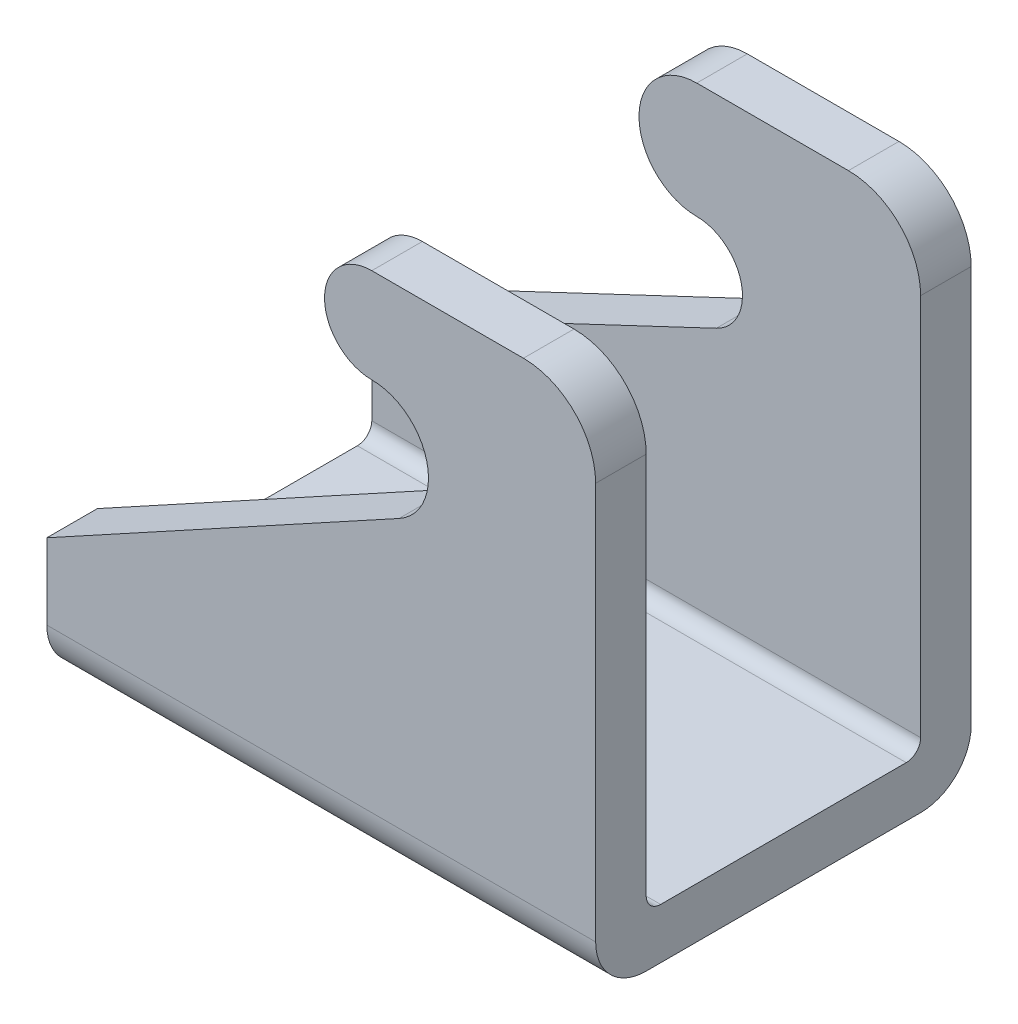
ISO-10303-21;
HEADER;
FILE_DESCRIPTION(('STEP AP214'),'2;1');
FILE_NAME('part.step','',(''),(''),'','','');
FILE_SCHEMA(('AUTOMOTIVE_DESIGN { 1 0 10303 214 1 1 1 1 }'));
ENDSEC;
DATA;
#1=APPLICATION_CONTEXT('core data for automotive mechanical design processes');
#2=APPLICATION_PROTOCOL_DEFINITION('international standard','automotive_design',2000,#1);
#3=PRODUCT_CONTEXT('',#1,'mechanical');
#4=PRODUCT('Part','Part','',(#3));
#5=PRODUCT_RELATED_PRODUCT_CATEGORY('part','',(#4));
#6=PRODUCT_DEFINITION_FORMATION('','',#4);
#7=PRODUCT_DEFINITION_CONTEXT('part definition',#1,'design');
#8=PRODUCT_DEFINITION('design','',#6,#7);
#9=PRODUCT_DEFINITION_SHAPE('','',#8);
#10=(LENGTH_UNIT() NAMED_UNIT(*) SI_UNIT(.MILLI.,.METRE.));
#11=(NAMED_UNIT(*) PLANE_ANGLE_UNIT() SI_UNIT($,.RADIAN.));
#12=(NAMED_UNIT(*) SI_UNIT($,.STERADIAN.) SOLID_ANGLE_UNIT());
#13=UNCERTAINTY_MEASURE_WITH_UNIT(LENGTH_MEASURE(1.E-05),#10,'distance_accuracy_value','');
#14=(GEOMETRIC_REPRESENTATION_CONTEXT(3) GLOBAL_UNCERTAINTY_ASSIGNED_CONTEXT((#13)) GLOBAL_UNIT_ASSIGNED_CONTEXT((#10,
#11,#12)) REPRESENTATION_CONTEXT('',''));
#15=CARTESIAN_POINT('',(0.,0.,0.));
#16=DIRECTION('',(0.,0.,1.));
#17=DIRECTION('',(1.,0.,0.));
#18=AXIS2_PLACEMENT_3D('',#15,#16,#17);
#19=CARTESIAN_POINT('',(38.,36.,-13.));
#20=DIRECTION('',(0.,1.,0.));
#21=DIRECTION('',(0.,0.,1.));
#22=AXIS2_PLACEMENT_3D('',#19,#20,#21);
#23=PLANE('',#22);
#24=DIRECTION('',(1.,0.,0.));
#25=VECTOR('',#24,1.);
#26=CARTESIAN_POINT('',(0.,36.,-9.5));
#27=LINE('',#26,#25);
#28=CARTESIAN_POINT('',(22.5,36.,-9.49999999999999));
#29=VERTEX_POINT('',#28);
#30=CARTESIAN_POINT('',(33.,36.,-9.5));
#31=VERTEX_POINT('',#30);
#32=EDGE_CURVE('E196',#29,#31,#27,.T.);
#33=ORIENTED_EDGE('',*,*,#32,.T.);
#34=DIRECTION('',(0.,0.,1.));
#35=VECTOR('',#34,1.);
#36=CARTESIAN_POINT('',(33.,36.,-13.));
#37=LINE('',#36,#35);
#38=CARTESIAN_POINT('',(33.,36.,-13.));
#39=VERTEX_POINT('',#38);
#40=EDGE_CURVE('E45',#31,#39,#37,.F.);
#41=ORIENTED_EDGE('',*,*,#40,.T.);
#42=DIRECTION('',(-1.,0.,0.));
#43=VECTOR('',#42,1.);
#44=CARTESIAN_POINT('',(38.,36.,-13.));
#45=LINE('',#44,#43);
#46=CARTESIAN_POINT('',(22.5,36.,-13.));
#47=VERTEX_POINT('',#46);
#48=EDGE_CURVE('E254',#39,#47,#45,.T.);
#49=ORIENTED_EDGE('',*,*,#48,.T.);
#50=DIRECTION('',(0.,0.,-1.));
#51=VECTOR('',#50,1.);
#52=CARTESIAN_POINT('',(22.5,36.,13.001));
#53=LINE('',#52,#51);
#54=EDGE_CURVE('E193',#29,#47,#53,.T.);
#55=ORIENTED_EDGE('',*,*,#54,.F.);
#56=EDGE_LOOP('',(#33,#41,#49,#55));
#57=FACE_BOUND('',#56,.T.);
#58=ADVANCED_FACE('F37',(#57),#23,.T.);
#59=DIRECTION('',(-1.,0.,0.));
#60=VECTOR('',#59,1.);
#61=CARTESIAN_POINT('',(38.,36.,13.));
#62=LINE('',#61,#60);
#63=CARTESIAN_POINT('',(33.,36.,13.));
#64=VERTEX_POINT('',#63);
#65=CARTESIAN_POINT('',(22.5,36.,13.));
#66=VERTEX_POINT('',#65);
#67=EDGE_CURVE('E251',#64,#66,#62,.T.);
#68=ORIENTED_EDGE('',*,*,#67,.F.);
#69=DIRECTION('',(0.,0.,1.));
#70=VECTOR('',#69,1.);
#71=CARTESIAN_POINT('',(33.,36.,-13.));
#72=LINE('',#71,#70);
#73=CARTESIAN_POINT('',(33.,36.,9.5));
#74=VERTEX_POINT('',#73);
#75=EDGE_CURVE('E320',#64,#74,#72,.F.);
#76=ORIENTED_EDGE('',*,*,#75,.T.);
#77=DIRECTION('',(1.,0.,0.));
#78=VECTOR('',#77,1.);
#79=CARTESIAN_POINT('',(0.,36.,9.5));
#80=LINE('',#79,#78);
#81=CARTESIAN_POINT('',(22.5,36.,9.49999999999999));
#82=VERTEX_POINT('',#81);
#83=EDGE_CURVE('E244',#82,#74,#80,.T.);
#84=ORIENTED_EDGE('',*,*,#83,.F.);
#85=DIRECTION('',(0.,0.,1.));
#86=VECTOR('',#85,1.);
#87=CARTESIAN_POINT('',(22.5,36.,-13.001));
#88=LINE('',#87,#86);
#89=EDGE_CURVE('E217',#82,#66,#88,.T.);
#90=ORIENTED_EDGE('',*,*,#89,.T.);
#91=EDGE_LOOP('',(#68,#76,#84,#90));
#92=FACE_BOUND('',#91,.T.);
#93=ADVANCED_FACE('F344',(#92),#23,.T.);
#94=CARTESIAN_POINT('',(38.,0.,-13.));
#95=DIRECTION('',(1.,0.,0.));
#96=DIRECTION('',(0.,0.,-1.));
#97=AXIS2_PLACEMENT_3D('',#94,#95,#96);
#98=PLANE('',#97);
#99=DIRECTION('',(0.,-1.,0.));
#100=VECTOR('',#99,1.);
#101=CARTESIAN_POINT('',(38.,36.,9.5));
#102=LINE('',#101,#100);
#103=CARTESIAN_POINT('',(38.,31.,9.5));
#104=VERTEX_POINT('',#103);
#105=CARTESIAN_POINT('',(38.,4.5,9.5));
#106=VERTEX_POINT('',#105);
#107=EDGE_CURVE('E234',#104,#106,#102,.T.);
#108=ORIENTED_EDGE('',*,*,#107,.F.);
#109=DIRECTION('',(0.,0.,1.));
#110=VECTOR('',#109,1.);
#111=CARTESIAN_POINT('',(38.,31.,-13.));
#112=LINE('',#111,#110);
#113=CARTESIAN_POINT('',(38.,31.,13.));
#114=VERTEX_POINT('',#113);
#115=EDGE_CURVE('E315',#104,#114,#112,.T.);
#116=ORIENTED_EDGE('',*,*,#115,.T.);
#117=DIRECTION('',(0.,1.,0.));
#118=VECTOR('',#117,1.);
#119=CARTESIAN_POINT('',(38.,0.,13.));
#120=LINE('',#119,#118);
#121=CARTESIAN_POINT('',(38.,3.5,13.));
#122=VERTEX_POINT('',#121);
#123=EDGE_CURVE('E257',#122,#114,#120,.T.);
#124=ORIENTED_EDGE('',*,*,#123,.F.);
#125=CARTESIAN_POINT('',(38.,3.5,9.5));
#126=DIRECTION('',(1.,0.,0.));
#127=DIRECTION('',(0.,0.,-1.));
#128=AXIS2_PLACEMENT_3D('',#125,#126,#127);
#129=CIRCLE('',#128,3.5);
#130=CARTESIAN_POINT('',(38.,0.,9.5));
#131=VERTEX_POINT('',#130);
#132=EDGE_CURVE('E299',#122,#131,#129,.T.);
#133=ORIENTED_EDGE('',*,*,#132,.T.);
#134=DIRECTION('',(0.,0.,1.));
#135=VECTOR('',#134,1.);
#136=CARTESIAN_POINT('',(38.,0.,-13.));
#137=LINE('',#136,#135);
#138=CARTESIAN_POINT('',(38.,0.,-9.5));
#139=VERTEX_POINT('',#138);
#140=EDGE_CURVE('E270',#139,#131,#137,.T.);
#141=ORIENTED_EDGE('',*,*,#140,.F.);
#142=CARTESIAN_POINT('',(38.,3.5,-9.5));
#143=DIRECTION('',(1.,0.,0.));
#144=DIRECTION('',(0.,0.,-1.));
#145=AXIS2_PLACEMENT_3D('',#142,#143,#144);
#146=CIRCLE('',#145,3.5);
#147=CARTESIAN_POINT('',(38.,3.5,-13.));
#148=VERTEX_POINT('',#147);
#149=EDGE_CURVE('E297',#139,#148,#146,.T.);
#150=ORIENTED_EDGE('',*,*,#149,.T.);
#151=DIRECTION('',(0.,1.,0.));
#152=VECTOR('',#151,1.);
#153=CARTESIAN_POINT('',(38.,0.,-13.));
#154=LINE('',#153,#152);
#155=CARTESIAN_POINT('',(38.,31.,-13.));
#156=VERTEX_POINT('',#155);
#157=EDGE_CURVE('E260',#148,#156,#154,.T.);
#158=ORIENTED_EDGE('',*,*,#157,.T.);
#159=DIRECTION('',(0.,0.,1.));
#160=VECTOR('',#159,1.);
#161=CARTESIAN_POINT('',(38.,31.,-13.));
#162=LINE('',#161,#160);
#163=CARTESIAN_POINT('',(38.,31.,-9.5));
#164=VERTEX_POINT('',#163);
#165=EDGE_CURVE('E312',#156,#164,#162,.T.);
#166=ORIENTED_EDGE('',*,*,#165,.T.);
#167=DIRECTION('',(0.,1.,0.));
#168=VECTOR('',#167,1.);
#169=CARTESIAN_POINT('',(38.,3.5,-9.5));
#170=LINE('',#169,#168);
#171=CARTESIAN_POINT('',(38.,4.5,-9.5));
#172=VERTEX_POINT('',#171);
#173=EDGE_CURVE('E239',#172,#164,#170,.T.);
#174=ORIENTED_EDGE('',*,*,#173,.F.);
#175=CARTESIAN_POINT('',(38.,4.5,-8.5));
#176=DIRECTION('',(1.,0.,0.));
#177=DIRECTION('',(0.,0.,-1.));
#178=AXIS2_PLACEMENT_3D('',#175,#176,#177);
#179=CIRCLE('',#178,1.);
#180=CARTESIAN_POINT('',(38.,3.5,-8.5));
#181=VERTEX_POINT('',#180);
#182=EDGE_CURVE('E285',#172,#181,#179,.F.);
#183=ORIENTED_EDGE('',*,*,#182,.T.);
#184=DIRECTION('',(0.,0.,-1.));
#185=VECTOR('',#184,1.);
#186=CARTESIAN_POINT('',(38.,3.5,9.5));
#187=LINE('',#186,#185);
#188=CARTESIAN_POINT('',(38.,3.5,8.5));
#189=VERTEX_POINT('',#188);
#190=EDGE_CURVE('E246',#189,#181,#187,.T.);
#191=ORIENTED_EDGE('',*,*,#190,.F.);
#192=CARTESIAN_POINT('',(38.,4.5,8.5));
#193=DIRECTION('',(1.,0.,0.));
#194=DIRECTION('',(0.,0.,-1.));
#195=AXIS2_PLACEMENT_3D('',#192,#193,#194);
#196=CIRCLE('',#195,1.);
#197=EDGE_CURVE('E289',#189,#106,#196,.F.);
#198=ORIENTED_EDGE('',*,*,#197,.T.);
#199=EDGE_LOOP('',(#108,#116,#124,#133,#141,#150,#158,#166,#174,#183,#191,#198));
#200=FACE_BOUND('',#199,.T.);
#201=ADVANCED_FACE('F334',(#200),#98,.T.);
#202=CARTESIAN_POINT('',(0.,0.,-13.));
#203=DIRECTION('',(0.,-1.,0.));
#204=DIRECTION('',(0.,0.,-1.));
#205=AXIS2_PLACEMENT_3D('',#202,#203,#204);
#206=PLANE('',#205);
#207=ORIENTED_EDGE('',*,*,#140,.T.);
#208=DIRECTION('',(1.,0.,0.));
#209=VECTOR('',#208,1.);
#210=CARTESIAN_POINT('',(0.,0.,9.5));
#211=LINE('',#210,#209);
#212=CARTESIAN_POINT('',(0.,0.,9.5));
#213=VERTEX_POINT('',#212);
#214=EDGE_CURVE('E304',#131,#213,#211,.F.);
#215=ORIENTED_EDGE('',*,*,#214,.T.);
#216=DIRECTION('',(0.,0.,1.));
#217=VECTOR('',#216,1.);
#218=CARTESIAN_POINT('',(0.,0.,-13.));
#219=LINE('',#218,#217);
#220=CARTESIAN_POINT('',(0.,0.,-9.5));
#221=VERTEX_POINT('',#220);
#222=EDGE_CURVE('E263',#221,#213,#219,.T.);
#223=ORIENTED_EDGE('',*,*,#222,.F.);
#224=DIRECTION('',(1.,0.,0.));
#225=VECTOR('',#224,1.);
#226=CARTESIAN_POINT('',(38.,0.,-9.5));
#227=LINE('',#226,#225);
#228=EDGE_CURVE('E301',#221,#139,#227,.T.);
#229=ORIENTED_EDGE('',*,*,#228,.T.);
#230=EDGE_LOOP('',(#207,#215,#223,#229));
#231=FACE_BOUND('',#230,.T.);
#232=ADVANCED_FACE('F368',(#231),#206,.T.);
#233=CARTESIAN_POINT('',(0.,36.,-13.));
#234=DIRECTION('',(-1.,0.,0.));
#235=DIRECTION('',(0.,0.,1.));
#236=AXIS2_PLACEMENT_3D('',#233,#234,#235);
#237=PLANE('',#236);
#238=ORIENTED_EDGE('',*,*,#222,.T.);
#239=CARTESIAN_POINT('',(0.,3.5,9.5));
#240=DIRECTION('',(-1.,0.,0.));
#241=DIRECTION('',(0.,0.,1.));
#242=AXIS2_PLACEMENT_3D('',#239,#240,#241);
#243=CIRCLE('',#242,3.5);
#244=CARTESIAN_POINT('',(0.,3.5,13.));
#245=VERTEX_POINT('',#244);
#246=EDGE_CURVE('E308',#213,#245,#243,.T.);
#247=ORIENTED_EDGE('',*,*,#246,.T.);
#248=DIRECTION('',(0.,-1.,0.));
#249=VECTOR('',#248,1.);
#250=CARTESIAN_POINT('',(0.,36.,13.));
#251=LINE('',#250,#249);
#252=CARTESIAN_POINT('',(0.,8.73428883746661,13.));
#253=VERTEX_POINT('',#252);
#254=EDGE_CURVE('E265',#253,#245,#251,.T.);
#255=ORIENTED_EDGE('',*,*,#254,.F.);
#256=DIRECTION('',(0.,0.,1.));
#257=VECTOR('',#256,1.);
#258=CARTESIAN_POINT('',(0.,8.73428883746661,-13.001));
#259=LINE('',#258,#257);
#260=CARTESIAN_POINT('',(0.,8.73428883746661,9.49999999999999));
#261=VERTEX_POINT('',#260);
#262=EDGE_CURVE('E229',#261,#253,#259,.T.);
#263=ORIENTED_EDGE('',*,*,#262,.F.);
#264=DIRECTION('',(0.,-1.,0.));
#265=VECTOR('',#264,1.);
#266=CARTESIAN_POINT('',(0.,36.,9.5));
#267=LINE('',#266,#265);
#268=CARTESIAN_POINT('',(0.,4.5,9.5));
#269=VERTEX_POINT('',#268);
#270=EDGE_CURVE('E235',#261,#269,#267,.T.);
#271=ORIENTED_EDGE('',*,*,#270,.T.);
#272=CARTESIAN_POINT('',(0.,4.5,8.5));
#273=DIRECTION('',(-1.,0.,0.));
#274=DIRECTION('',(0.,0.,1.));
#275=AXIS2_PLACEMENT_3D('',#272,#273,#274);
#276=CIRCLE('',#275,1.);
#277=CARTESIAN_POINT('',(0.,3.5,8.5));
#278=VERTEX_POINT('',#277);
#279=EDGE_CURVE('E292',#269,#278,#276,.F.);
#280=ORIENTED_EDGE('',*,*,#279,.T.);
#281=DIRECTION('',(0.,0.,-1.));
#282=VECTOR('',#281,1.);
#283=CARTESIAN_POINT('',(0.,3.5,9.5));
#284=LINE('',#283,#282);
#285=CARTESIAN_POINT('',(0.,3.5,-8.5));
#286=VERTEX_POINT('',#285);
#287=EDGE_CURVE('E238',#278,#286,#284,.T.);
#288=ORIENTED_EDGE('',*,*,#287,.T.);
#289=CARTESIAN_POINT('',(0.,4.5,-8.5));
#290=DIRECTION('',(-1.,0.,0.));
#291=DIRECTION('',(0.,0.,1.));
#292=AXIS2_PLACEMENT_3D('',#289,#290,#291);
#293=CIRCLE('',#292,1.);
#294=CARTESIAN_POINT('',(0.,4.5,-9.5));
#295=VERTEX_POINT('',#294);
#296=EDGE_CURVE('E287',#286,#295,#293,.F.);
#297=ORIENTED_EDGE('',*,*,#296,.T.);
#298=DIRECTION('',(0.,1.,0.));
#299=VECTOR('',#298,1.);
#300=CARTESIAN_POINT('',(0.,3.5,-9.5));
#301=LINE('',#300,#299);
#302=CARTESIAN_POINT('',(0.,10.7,-9.49999999999999));
#303=VERTEX_POINT('',#302);
#304=EDGE_CURVE('E242',#295,#303,#301,.T.);
#305=ORIENTED_EDGE('',*,*,#304,.T.);
#306=DIRECTION('',(0.,0.,-1.));
#307=VECTOR('',#306,1.);
#308=CARTESIAN_POINT('',(0.,10.7,13.001));
#309=LINE('',#308,#307);
#310=CARTESIAN_POINT('',(0.,10.7,-13.));
#311=VERTEX_POINT('',#310);
#312=EDGE_CURVE('E206',#303,#311,#309,.T.);
#313=ORIENTED_EDGE('',*,*,#312,.T.);
#314=DIRECTION('',(0.,-1.,0.));
#315=VECTOR('',#314,1.);
#316=CARTESIAN_POINT('',(0.,36.,-13.));
#317=LINE('',#316,#315);
#318=CARTESIAN_POINT('',(0.,3.5,-13.));
#319=VERTEX_POINT('',#318);
#320=EDGE_CURVE('E256',#311,#319,#317,.T.);
#321=ORIENTED_EDGE('',*,*,#320,.T.);
#322=CARTESIAN_POINT('',(0.,3.5,-9.5));
#323=DIRECTION('',(-1.,0.,0.));
#324=DIRECTION('',(0.,0.,1.));
#325=AXIS2_PLACEMENT_3D('',#322,#323,#324);
#326=CIRCLE('',#325,3.5);
#327=EDGE_CURVE('E306',#319,#221,#326,.T.);
#328=ORIENTED_EDGE('',*,*,#327,.T.);
#329=EDGE_LOOP('',(#238,#247,#255,#263,#271,#280,#288,#297,#305,#313,#321,#328));
#330=FACE_BOUND('',#329,.T.);
#331=ADVANCED_FACE('F360',(#330),#237,.T.);
#332=CARTESIAN_POINT('',(0.,0.,-13.));
#333=DIRECTION('',(0.,0.,1.));
#334=DIRECTION('',(1.,0.,0.));
#335=AXIS2_PLACEMENT_3D('',#332,#333,#334);
#336=PLANE('',#335);
#337=ORIENTED_EDGE('',*,*,#48,.F.);
#338=CARTESIAN_POINT('',(33.,31.,-13.));
#339=DIRECTION('',(0.,0.,1.));
#340=DIRECTION('',(1.,0.,0.));
#341=AXIS2_PLACEMENT_3D('',#338,#339,#340);
#342=CIRCLE('',#341,5.);
#343=EDGE_CURVE('E11',#39,#156,#342,.F.);
#344=ORIENTED_EDGE('',*,*,#343,.T.);
#345=ORIENTED_EDGE('',*,*,#157,.F.);
#346=DIRECTION('',(1.,0.,0.));
#347=VECTOR('',#346,1.);
#348=CARTESIAN_POINT('',(0.,3.5,-13.));
#349=LINE('',#348,#347);
#350=EDGE_CURVE('E310',#148,#319,#349,.F.);
#351=ORIENTED_EDGE('',*,*,#350,.T.);
#352=ORIENTED_EDGE('',*,*,#320,.F.);
#353=DIRECTION('',(-0.904118037486185,-0.427282780242933,0.));
#354=VECTOR('',#353,1.);
#355=CARTESIAN_POINT('',(23.8525398198357,21.972620506955,-13.));
#356=LINE('',#355,#354);
#357=CARTESIAN_POINT('',(23.8525398198357,21.972620506955,-13.));
#358=VERTEX_POINT('',#357);
#359=EDGE_CURVE('E185',#358,#311,#356,.T.);
#360=ORIENTED_EDGE('',*,*,#359,.F.);
#361=CARTESIAN_POINT('',(22.5,24.8345557500194,-13.));
#362=DIRECTION('',(0.,0.,-1.));
#363=DIRECTION('',(-1.,0.,0.));
#364=AXIS2_PLACEMENT_3D('',#361,#362,#363);
#365=CIRCLE('',#364,3.16544424998061);
#366=CARTESIAN_POINT('',(22.5,28.,-13.));
#367=VERTEX_POINT('',#366);
#368=EDGE_CURVE('E199',#367,#358,#365,.T.);
#369=ORIENTED_EDGE('',*,*,#368,.F.);
#370=CARTESIAN_POINT('',(22.5,32.,-13.));
#371=DIRECTION('',(0.,0.,1.));
#372=DIRECTION('',(1.,0.,0.));
#373=AXIS2_PLACEMENT_3D('',#370,#371,#372);
#374=CIRCLE('',#373,4.);
#375=EDGE_CURVE('E180',#47,#367,#374,.T.);
#376=ORIENTED_EDGE('',*,*,#375,.F.);
#377=EDGE_LOOP('',(#337,#344,#345,#351,#352,#360,#369,#376));
#378=FACE_BOUND('',#377,.T.);
#379=ADVANCED_FACE('F377',(#378),#336,.F.);
#380=CARTESIAN_POINT('',(0.,0.,13.));
#381=DIRECTION('',(0.,0.,1.));
#382=DIRECTION('',(1.,0.,0.));
#383=AXIS2_PLACEMENT_3D('',#380,#381,#382);
#384=PLANE('',#383);
#385=ORIENTED_EDGE('',*,*,#123,.T.);
#386=CARTESIAN_POINT('',(33.,31.,13.));
#387=DIRECTION('',(0.,0.,1.));
#388=DIRECTION('',(1.,0.,0.));
#389=AXIS2_PLACEMENT_3D('',#386,#387,#388);
#390=CIRCLE('',#389,5.);
#391=EDGE_CURVE('E318',#114,#64,#390,.T.);
#392=ORIENTED_EDGE('',*,*,#391,.T.);
#393=ORIENTED_EDGE('',*,*,#67,.T.);
#394=CARTESIAN_POINT('',(22.5,32.7264147347503,13.));
#395=DIRECTION('',(0.,0.,-1.));
#396=DIRECTION('',(-1.,0.,0.));
#397=AXIS2_PLACEMENT_3D('',#394,#395,#396);
#398=CIRCLE('',#397,3.27358526524967);
#399=CARTESIAN_POINT('',(22.5,29.4528294695007,13.));
#400=VERTEX_POINT('',#399);
#401=EDGE_CURVE('E218',#400,#66,#398,.T.);
#402=ORIENTED_EDGE('',*,*,#401,.F.);
#403=CARTESIAN_POINT('',(22.5,25.5271128726081,13.));
#404=DIRECTION('',(0.,0.,1.));
#405=DIRECTION('',(1.,0.,0.));
#406=AXIS2_PLACEMENT_3D('',#403,#404,#405);
#407=CIRCLE('',#406,3.92571659689259);
#408=CARTESIAN_POINT('',(24.38509945709,22.0836188859723,13.));
#409=VERTEX_POINT('',#408);
#410=EDGE_CURVE('E212',#409,#400,#407,.T.);
#411=ORIENTED_EDGE('',*,*,#410,.F.);
#412=DIRECTION('',(0.87716316286344,0.48019244654139,0.));
#413=VECTOR('',#412,1.);
#414=CARTESIAN_POINT('',(0.,8.73428883746661,13.));
#415=LINE('',#414,#413);
#416=EDGE_CURVE('E214',#253,#409,#415,.T.);
#417=ORIENTED_EDGE('',*,*,#416,.F.);
#418=ORIENTED_EDGE('',*,*,#254,.T.);
#419=DIRECTION('',(1.,0.,0.));
#420=VECTOR('',#419,1.);
#421=CARTESIAN_POINT('',(0.,3.5,13.));
#422=LINE('',#421,#420);
#423=EDGE_CURVE('E294',#245,#122,#422,.T.);
#424=ORIENTED_EDGE('',*,*,#423,.T.);
#425=EDGE_LOOP('',(#385,#392,#393,#402,#411,#417,#418,#424));
#426=FACE_BOUND('',#425,.T.);
#427=ADVANCED_FACE('F341',(#426),#384,.T.);
#428=CARTESIAN_POINT('',(0.,3.5,-9.5));
#429=DIRECTION('',(0.,0.,-1.));
#430=DIRECTION('',(-1.,0.,0.));
#431=AXIS2_PLACEMENT_3D('',#428,#429,#430);
#432=PLANE('',#431);
#433=ORIENTED_EDGE('',*,*,#173,.T.);
#434=CARTESIAN_POINT('',(33.,31.,-9.5));
#435=DIRECTION('',(0.,0.,-1.));
#436=DIRECTION('',(-1.,0.,0.));
#437=AXIS2_PLACEMENT_3D('',#434,#435,#436);
#438=CIRCLE('',#437,5.);
#439=EDGE_CURVE('E59',#164,#31,#438,.F.);
#440=ORIENTED_EDGE('',*,*,#439,.T.);
#441=ORIENTED_EDGE('',*,*,#32,.F.);
#442=CARTESIAN_POINT('',(22.5,32.,-9.5));
#443=DIRECTION('',(0.,0.,-1.));
#444=DIRECTION('',(-1.,0.,0.));
#445=AXIS2_PLACEMENT_3D('',#442,#443,#444);
#446=CIRCLE('',#445,4.);
#447=CARTESIAN_POINT('',(22.5,28.,-9.5));
#448=VERTEX_POINT('',#447);
#449=EDGE_CURVE('E177',#448,#29,#446,.T.);
#450=ORIENTED_EDGE('',*,*,#449,.F.);
#451=CARTESIAN_POINT('',(22.5,24.8345557500194,-9.5));
#452=DIRECTION('',(0.,0.,-1.));
#453=DIRECTION('',(-1.,0.,0.));
#454=AXIS2_PLACEMENT_3D('',#451,#452,#453);
#455=CIRCLE('',#454,3.16544424998061);
#456=CARTESIAN_POINT('',(23.8525398198357,21.972620506955,-9.5));
#457=VERTEX_POINT('',#456);
#458=EDGE_CURVE('E189',#457,#448,#455,.F.);
#459=ORIENTED_EDGE('',*,*,#458,.F.);
#460=DIRECTION('',(0.904118037486185,0.427282780242933,0.));
#461=VECTOR('',#460,1.);
#462=CARTESIAN_POINT('',(23.8525398198357,21.972620506955,-9.5));
#463=LINE('',#462,#461);
#464=EDGE_CURVE('E197',#303,#457,#463,.T.);
#465=ORIENTED_EDGE('',*,*,#464,.F.);
#466=ORIENTED_EDGE('',*,*,#304,.F.);
#467=DIRECTION('',(1.,0.,0.));
#468=VECTOR('',#467,1.);
#469=CARTESIAN_POINT('',(38.,4.5,-9.5));
#470=LINE('',#469,#468);
#471=EDGE_CURVE('E273',#295,#172,#470,.T.);
#472=ORIENTED_EDGE('',*,*,#471,.T.);
#473=EDGE_LOOP('',(#433,#440,#441,#450,#459,#465,#466,#472));
#474=FACE_BOUND('',#473,.T.);
#475=ADVANCED_FACE('F195',(#474),#432,.F.);
#476=CARTESIAN_POINT('',(0.,3.5,9.5));
#477=DIRECTION('',(0.,-1.,0.));
#478=DIRECTION('',(0.,0.,-1.));
#479=AXIS2_PLACEMENT_3D('',#476,#477,#478);
#480=PLANE('',#479);
#481=ORIENTED_EDGE('',*,*,#190,.T.);
#482=DIRECTION('',(1.,0.,0.));
#483=VECTOR('',#482,1.);
#484=CARTESIAN_POINT('',(0.,3.5,-8.5));
#485=LINE('',#484,#483);
#486=EDGE_CURVE('E281',#181,#286,#485,.F.);
#487=ORIENTED_EDGE('',*,*,#486,.T.);
#488=ORIENTED_EDGE('',*,*,#287,.F.);
#489=DIRECTION('',(1.,0.,0.));
#490=VECTOR('',#489,1.);
#491=CARTESIAN_POINT('',(38.,3.5,8.5));
#492=LINE('',#491,#490);
#493=EDGE_CURVE('E278',#278,#189,#492,.T.);
#494=ORIENTED_EDGE('',*,*,#493,.T.);
#495=EDGE_LOOP('',(#481,#487,#488,#494));
#496=FACE_BOUND('',#495,.T.);
#497=ADVANCED_FACE('F389',(#496),#480,.F.);
#498=CARTESIAN_POINT('',(0.,36.,9.5));
#499=DIRECTION('',(0.,0.,1.));
#500=DIRECTION('',(1.,0.,0.));
#501=AXIS2_PLACEMENT_3D('',#498,#499,#500);
#502=PLANE('',#501);
#503=ORIENTED_EDGE('',*,*,#83,.T.);
#504=CARTESIAN_POINT('',(33.,31.,9.5));
#505=DIRECTION('',(0.,0.,1.));
#506=DIRECTION('',(1.,0.,0.));
#507=AXIS2_PLACEMENT_3D('',#504,#505,#506);
#508=CIRCLE('',#507,5.);
#509=EDGE_CURVE('E322',#74,#104,#508,.F.);
#510=ORIENTED_EDGE('',*,*,#509,.T.);
#511=ORIENTED_EDGE('',*,*,#107,.T.);
#512=DIRECTION('',(1.,0.,0.));
#513=VECTOR('',#512,1.);
#514=CARTESIAN_POINT('',(0.,4.5,9.5));
#515=LINE('',#514,#513);
#516=EDGE_CURVE('E283',#106,#269,#515,.F.);
#517=ORIENTED_EDGE('',*,*,#516,.T.);
#518=ORIENTED_EDGE('',*,*,#270,.F.);
#519=DIRECTION('',(-0.87716316286344,-0.48019244654139,0.));
#520=VECTOR('',#519,1.);
#521=CARTESIAN_POINT('',(0.,8.73428883746661,9.5));
#522=LINE('',#521,#520);
#523=CARTESIAN_POINT('',(24.38509945709,22.0836188859723,9.49999999999999));
#524=VERTEX_POINT('',#523);
#525=EDGE_CURVE('E213',#524,#261,#522,.T.);
#526=ORIENTED_EDGE('',*,*,#525,.F.);
#527=CARTESIAN_POINT('',(22.5,25.5271128726081,9.5));
#528=DIRECTION('',(0.,0.,1.));
#529=DIRECTION('',(1.,0.,0.));
#530=AXIS2_PLACEMENT_3D('',#527,#528,#529);
#531=CIRCLE('',#530,3.92571659689259);
#532=CARTESIAN_POINT('',(22.5,29.4528294695006,9.5));
#533=VERTEX_POINT('',#532);
#534=EDGE_CURVE('E192',#533,#524,#531,.F.);
#535=ORIENTED_EDGE('',*,*,#534,.F.);
#536=CARTESIAN_POINT('',(22.5,32.7264147347503,9.5));
#537=DIRECTION('',(0.,0.,1.));
#538=DIRECTION('',(1.,0.,0.));
#539=AXIS2_PLACEMENT_3D('',#536,#537,#538);
#540=CIRCLE('',#539,3.27358526524967);
#541=EDGE_CURVE('E210',#82,#533,#540,.T.);
#542=ORIENTED_EDGE('',*,*,#541,.F.);
#543=EDGE_LOOP('',(#503,#510,#511,#517,#518,#526,#535,#542));
#544=FACE_BOUND('',#543,.T.);
#545=ADVANCED_FACE('F327',(#544),#502,.F.);
#546=CARTESIAN_POINT('',(22.5,32.7264147347503,-13.001));
#547=DIRECTION('',(0.,0.,1.));
#548=DIRECTION('',(1.,0.,0.));
#549=AXIS2_PLACEMENT_3D('',#546,#547,#548);
#550=CYLINDRICAL_SURFACE('',#549,3.27358526524967);
#551=ORIENTED_EDGE('',*,*,#541,.T.);
#552=DIRECTION('',(0.,0.,1.));
#553=VECTOR('',#552,1.);
#554=CARTESIAN_POINT('',(22.5,29.4528294695007,-13.001));
#555=LINE('',#554,#553);
#556=EDGE_CURVE('E228',#533,#400,#555,.T.);
#557=ORIENTED_EDGE('',*,*,#556,.T.);
#558=ORIENTED_EDGE('',*,*,#401,.T.);
#559=ORIENTED_EDGE('',*,*,#89,.F.);
#560=EDGE_LOOP('',(#551,#557,#558,#559));
#561=FACE_BOUND('',#560,.T.);
#562=ADVANCED_FACE('F346',(#561),#550,.T.);
#563=CARTESIAN_POINT('',(0.,8.73428883746661,-13.001));
#564=DIRECTION('',(0.48019244654139,-0.87716316286344,0.));
#565=DIRECTION('',(0.87716316286344,0.48019244654139,0.));
#566=AXIS2_PLACEMENT_3D('',#563,#564,#565);
#567=PLANE('',#566);
#568=ORIENTED_EDGE('',*,*,#525,.T.);
#569=ORIENTED_EDGE('',*,*,#262,.T.);
#570=ORIENTED_EDGE('',*,*,#416,.T.);
#571=DIRECTION('',(0.,0.,1.));
#572=VECTOR('',#571,1.);
#573=CARTESIAN_POINT('',(24.38509945709,22.0836188859723,-13.001));
#574=LINE('',#573,#572);
#575=EDGE_CURVE('E226',#524,#409,#574,.T.);
#576=ORIENTED_EDGE('',*,*,#575,.F.);
#577=EDGE_LOOP('',(#568,#569,#570,#576));
#578=FACE_BOUND('',#577,.T.);
#579=ADVANCED_FACE('F555',(#578),#567,.F.);
#580=CARTESIAN_POINT('',(22.5,25.5271128726081,-13.001));
#581=DIRECTION('',(0.,0.,1.));
#582=DIRECTION('',(1.,0.,0.));
#583=AXIS2_PLACEMENT_3D('',#580,#581,#582);
#584=CYLINDRICAL_SURFACE('',#583,3.92571659689259);
#585=ORIENTED_EDGE('',*,*,#534,.T.);
#586=ORIENTED_EDGE('',*,*,#575,.T.);
#587=ORIENTED_EDGE('',*,*,#410,.T.);
#588=ORIENTED_EDGE('',*,*,#556,.F.);
#589=EDGE_LOOP('',(#585,#586,#587,#588));
#590=FACE_BOUND('',#589,.T.);
#591=ADVANCED_FACE('F352',(#590),#584,.F.);
#592=CARTESIAN_POINT('',(22.5,32.,13.001));
#593=DIRECTION('',(0.,0.,-1.));
#594=DIRECTION('',(-1.,0.,0.));
#595=AXIS2_PLACEMENT_3D('',#592,#593,#594);
#596=CYLINDRICAL_SURFACE('',#595,4.);
#597=ORIENTED_EDGE('',*,*,#449,.T.);
#598=ORIENTED_EDGE('',*,*,#54,.T.);
#599=ORIENTED_EDGE('',*,*,#375,.T.);
#600=DIRECTION('',(0.,0.,-1.));
#601=VECTOR('',#600,1.);
#602=CARTESIAN_POINT('',(22.5,28.,13.001));
#603=LINE('',#602,#601);
#604=EDGE_CURVE('E172',#448,#367,#603,.T.);
#605=ORIENTED_EDGE('',*,*,#604,.F.);
#606=EDGE_LOOP('',(#597,#598,#599,#605));
#607=FACE_BOUND('',#606,.T.);
#608=ADVANCED_FACE('F174',(#607),#596,.T.);
#609=CARTESIAN_POINT('',(23.8525398198357,21.972620506955,13.001));
#610=DIRECTION('',(0.427282780242933,-0.904118037486185,0.));
#611=DIRECTION('',(0.904118037486185,0.427282780242933,0.));
#612=AXIS2_PLACEMENT_3D('',#609,#610,#611);
#613=PLANE('',#612);
#614=ORIENTED_EDGE('',*,*,#464,.T.);
#615=DIRECTION('',(0.,0.,-1.));
#616=VECTOR('',#615,1.);
#617=CARTESIAN_POINT('',(23.8525398198357,21.972620506955,13.001));
#618=LINE('',#617,#616);
#619=EDGE_CURVE('E184',#457,#358,#618,.T.);
#620=ORIENTED_EDGE('',*,*,#619,.T.);
#621=ORIENTED_EDGE('',*,*,#359,.T.);
#622=ORIENTED_EDGE('',*,*,#312,.F.);
#623=EDGE_LOOP('',(#614,#620,#621,#622));
#624=FACE_BOUND('',#623,.T.);
#625=ADVANCED_FACE('F397',(#624),#613,.F.);
#626=CARTESIAN_POINT('',(22.5,24.8345557500194,13.001));
#627=DIRECTION('',(0.,0.,-1.));
#628=DIRECTION('',(-1.,0.,0.));
#629=AXIS2_PLACEMENT_3D('',#626,#627,#628);
#630=CYLINDRICAL_SURFACE('',#629,3.16544424998061);
#631=ORIENTED_EDGE('',*,*,#458,.T.);
#632=ORIENTED_EDGE('',*,*,#604,.T.);
#633=ORIENTED_EDGE('',*,*,#368,.T.);
#634=ORIENTED_EDGE('',*,*,#619,.F.);
#635=EDGE_LOOP('',(#631,#632,#633,#634));
#636=FACE_BOUND('',#635,.T.);
#637=ADVANCED_FACE('F190',(#636),#630,.F.);
#638=CARTESIAN_POINT('',(0.,4.5,-8.5));
#639=DIRECTION('',(-1.,0.,0.));
#640=DIRECTION('',(0.,0.,1.));
#641=AXIS2_PLACEMENT_3D('',#638,#639,#640);
#642=CYLINDRICAL_SURFACE('',#641,1.);
#643=ORIENTED_EDGE('',*,*,#296,.F.);
#644=ORIENTED_EDGE('',*,*,#486,.F.);
#645=ORIENTED_EDGE('',*,*,#182,.F.);
#646=ORIENTED_EDGE('',*,*,#471,.F.);
#647=EDGE_LOOP('',(#643,#644,#645,#646));
#648=FACE_BOUND('',#647,.T.);
#649=ADVANCED_FACE('F386',(#648),#642,.F.);
#650=CARTESIAN_POINT('',(0.,4.5,8.5));
#651=DIRECTION('',(-1.,0.,0.));
#652=DIRECTION('',(0.,0.,1.));
#653=AXIS2_PLACEMENT_3D('',#650,#651,#652);
#654=CYLINDRICAL_SURFACE('',#653,1.);
#655=ORIENTED_EDGE('',*,*,#279,.F.);
#656=ORIENTED_EDGE('',*,*,#516,.F.);
#657=ORIENTED_EDGE('',*,*,#197,.F.);
#658=ORIENTED_EDGE('',*,*,#493,.F.);
#659=EDGE_LOOP('',(#655,#656,#657,#658));
#660=FACE_BOUND('',#659,.T.);
#661=ADVANCED_FACE('F394',(#660),#654,.F.);
#662=CARTESIAN_POINT('',(0.,3.5,9.5));
#663=DIRECTION('',(1.,0.,0.));
#664=DIRECTION('',(0.,0.,-1.));
#665=AXIS2_PLACEMENT_3D('',#662,#663,#664);
#666=CYLINDRICAL_SURFACE('',#665,3.5);
#667=ORIENTED_EDGE('',*,*,#246,.F.);
#668=ORIENTED_EDGE('',*,*,#214,.F.);
#669=ORIENTED_EDGE('',*,*,#132,.F.);
#670=ORIENTED_EDGE('',*,*,#423,.F.);
#671=EDGE_LOOP('',(#667,#668,#669,#670));
#672=FACE_BOUND('',#671,.T.);
#673=ADVANCED_FACE('F365',(#672),#666,.T.);
#674=CARTESIAN_POINT('',(0.,3.5,-9.5));
#675=DIRECTION('',(-1.,0.,0.));
#676=DIRECTION('',(0.,0.,1.));
#677=AXIS2_PLACEMENT_3D('',#674,#675,#676);
#678=CYLINDRICAL_SURFACE('',#677,3.5);
#679=ORIENTED_EDGE('',*,*,#327,.F.);
#680=ORIENTED_EDGE('',*,*,#350,.F.);
#681=ORIENTED_EDGE('',*,*,#149,.F.);
#682=ORIENTED_EDGE('',*,*,#228,.F.);
#683=EDGE_LOOP('',(#679,#680,#681,#682));
#684=FACE_BOUND('',#683,.T.);
#685=ADVANCED_FACE('F372',(#684),#678,.T.);
#686=CARTESIAN_POINT('',(33.,31.,-13.));
#687=DIRECTION('',(0.,0.,1.));
#688=DIRECTION('',(1.,0.,0.));
#689=AXIS2_PLACEMENT_3D('',#686,#687,#688);
#690=CYLINDRICAL_SURFACE('',#689,5.);
#691=ORIENTED_EDGE('',*,*,#509,.F.);
#692=ORIENTED_EDGE('',*,*,#75,.F.);
#693=ORIENTED_EDGE('',*,*,#391,.F.);
#694=ORIENTED_EDGE('',*,*,#115,.F.);
#695=EDGE_LOOP('',(#691,#692,#693,#694));
#696=FACE_BOUND('',#695,.T.);
#697=ADVANCED_FACE('F338',(#696),#690,.T.);
#698=CARTESIAN_POINT('',(33.,31.,-13.));
#699=DIRECTION('',(0.,0.,1.));
#700=DIRECTION('',(1.,0.,0.));
#701=AXIS2_PLACEMENT_3D('',#698,#699,#700);
#702=CYLINDRICAL_SURFACE('',#701,5.);
#703=ORIENTED_EDGE('',*,*,#343,.F.);
#704=ORIENTED_EDGE('',*,*,#40,.F.);
#705=ORIENTED_EDGE('',*,*,#439,.F.);
#706=ORIENTED_EDGE('',*,*,#165,.F.);
#707=EDGE_LOOP('',(#703,#704,#705,#706));
#708=FACE_BOUND('',#707,.T.);
#709=ADVANCED_FACE('F39',(#708),#702,.T.);
#710=CLOSED_SHELL('',(#58,#93,#201,#232,#331,#379,#427,#475,#497,#545,#562,#579,#591,#608,#625,
#637,#649,#661,#673,#685,#697,#709));
#711=MANIFOLD_SOLID_BREP('B2',#710);
#712=ADVANCED_BREP_SHAPE_REPRESENTATION('',(#18,#711),#14);
#713=SHAPE_DEFINITION_REPRESENTATION(#9,#712);
ENDSEC;
END-ISO-10303-21;
